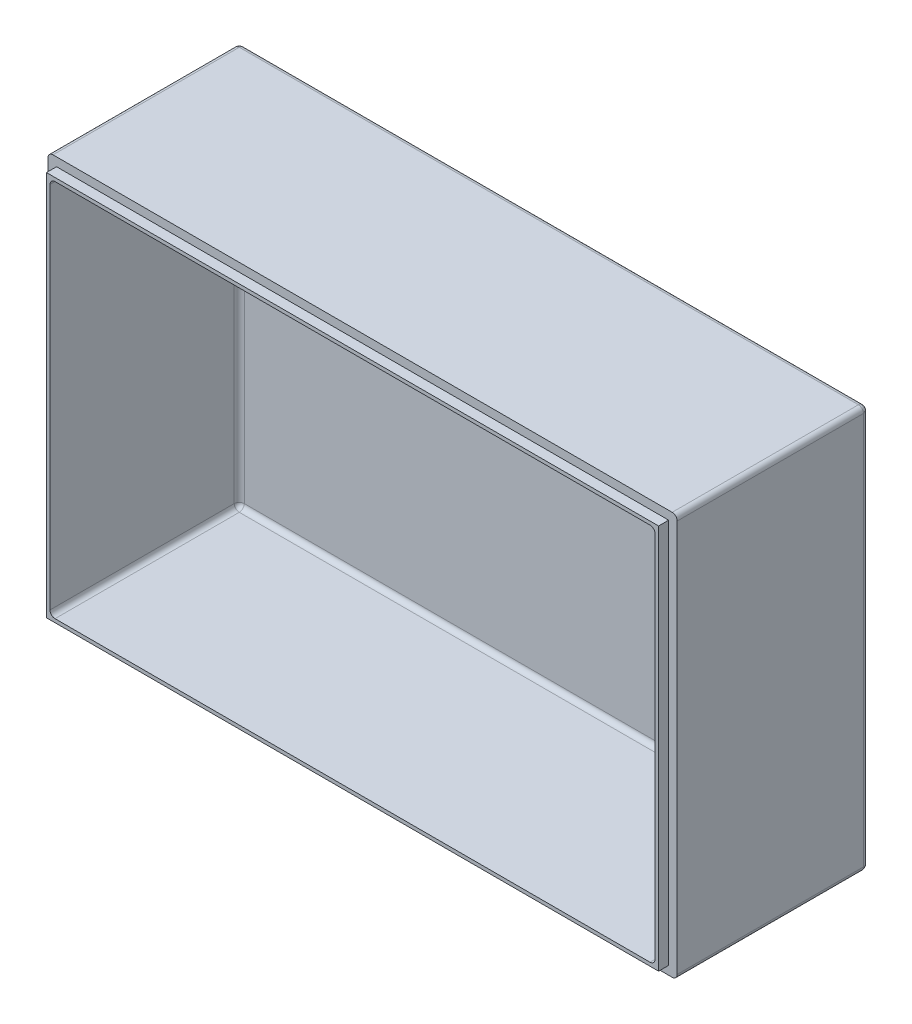
ISO-10303-21;
HEADER;
FILE_DESCRIPTION(('STEP AP214'),'2;1');
FILE_NAME('part.step','',(''),(''),'','','');
FILE_SCHEMA(('AUTOMOTIVE_DESIGN { 1 0 10303 214 1 1 1 1 }'));
ENDSEC;
DATA;
#1=APPLICATION_CONTEXT('core data for automotive mechanical design processes');
#2=APPLICATION_PROTOCOL_DEFINITION('international standard','automotive_design',2000,#1);
#3=PRODUCT_CONTEXT('',#1,'mechanical');
#4=PRODUCT('Part','Part','',(#3));
#5=PRODUCT_RELATED_PRODUCT_CATEGORY('part','',(#4));
#6=PRODUCT_DEFINITION_FORMATION('','',#4);
#7=PRODUCT_DEFINITION_CONTEXT('part definition',#1,'design');
#8=PRODUCT_DEFINITION('design','',#6,#7);
#9=PRODUCT_DEFINITION_SHAPE('','',#8);
#10=(LENGTH_UNIT() NAMED_UNIT(*) SI_UNIT(.MILLI.,.METRE.));
#11=(NAMED_UNIT(*) PLANE_ANGLE_UNIT() SI_UNIT($,.RADIAN.));
#12=(NAMED_UNIT(*) SI_UNIT($,.STERADIAN.) SOLID_ANGLE_UNIT());
#13=UNCERTAINTY_MEASURE_WITH_UNIT(LENGTH_MEASURE(1.E-05),#10,'distance_accuracy_value','');
#14=(GEOMETRIC_REPRESENTATION_CONTEXT(3) GLOBAL_UNCERTAINTY_ASSIGNED_CONTEXT((#13)) GLOBAL_UNIT_ASSIGNED_CONTEXT((#10,
#11,#12)) REPRESENTATION_CONTEXT('',''));
#15=CARTESIAN_POINT('',(0.,0.,0.));
#16=DIRECTION('',(0.,0.,1.));
#17=DIRECTION('',(1.,0.,0.));
#18=AXIS2_PLACEMENT_3D('',#15,#16,#17);
#19=CARTESIAN_POINT('',(0.,0.,40.));
#20=DIRECTION('',(0.,0.,1.));
#21=DIRECTION('',(1.,0.,0.));
#22=AXIS2_PLACEMENT_3D('',#19,#20,#21);
#23=PLANE('',#22);
#24=DIRECTION('',(0.,1.,0.));
#25=VECTOR('',#24,1.);
#26=CARTESIAN_POINT('',(60.1,37.6,40.));
#27=LINE('',#26,#25);
#28=CARTESIAN_POINT('',(60.1,-36.6,40.));
#29=VERTEX_POINT('',#28);
#30=CARTESIAN_POINT('',(60.1,36.6,40.));
#31=VERTEX_POINT('',#30);
#32=EDGE_CURVE('E253',#29,#31,#27,.T.);
#33=ORIENTED_EDGE('',*,*,#32,.F.);
#34=CARTESIAN_POINT('',(59.1,-36.6,40.));
#35=DIRECTION('',(0.,0.,1.));
#36=DIRECTION('',(1.,0.,0.));
#37=AXIS2_PLACEMENT_3D('',#34,#35,#36);
#38=CIRCLE('',#37,1.);
#39=CARTESIAN_POINT('',(59.1,-37.6,40.));
#40=VERTEX_POINT('',#39);
#41=EDGE_CURVE('E373',#29,#40,#38,.F.);
#42=ORIENTED_EDGE('',*,*,#41,.T.);
#43=DIRECTION('',(1.,0.,0.));
#44=VECTOR('',#43,1.);
#45=CARTESIAN_POINT('',(-60.1,-37.6,40.));
#46=LINE('',#45,#44);
#47=CARTESIAN_POINT('',(-59.1,-37.6,40.));
#48=VERTEX_POINT('',#47);
#49=EDGE_CURVE('E263',#48,#40,#46,.T.);
#50=ORIENTED_EDGE('',*,*,#49,.F.);
#51=CARTESIAN_POINT('',(-59.1,-36.6,40.));
#52=DIRECTION('',(0.,0.,1.));
#53=DIRECTION('',(1.,0.,0.));
#54=AXIS2_PLACEMENT_3D('',#51,#52,#53);
#55=CIRCLE('',#54,1.);
#56=CARTESIAN_POINT('',(-60.1,-36.6,40.));
#57=VERTEX_POINT('',#56);
#58=EDGE_CURVE('E11',#48,#57,#55,.F.);
#59=ORIENTED_EDGE('',*,*,#58,.T.);
#60=DIRECTION('',(0.,-1.,0.));
#61=VECTOR('',#60,1.);
#62=CARTESIAN_POINT('',(-60.1,37.6,40.));
#63=LINE('',#62,#61);
#64=CARTESIAN_POINT('',(-60.1,36.6,40.));
#65=VERTEX_POINT('',#64);
#66=EDGE_CURVE('E260',#65,#57,#63,.T.);
#67=ORIENTED_EDGE('',*,*,#66,.F.);
#68=CARTESIAN_POINT('',(-59.1,36.6,40.));
#69=DIRECTION('',(0.,0.,1.));
#70=DIRECTION('',(1.,0.,0.));
#71=AXIS2_PLACEMENT_3D('',#68,#69,#70);
#72=CIRCLE('',#71,1.);
#73=CARTESIAN_POINT('',(-59.1,37.6,40.));
#74=VERTEX_POINT('',#73);
#75=EDGE_CURVE('E46',#65,#74,#72,.F.);
#76=ORIENTED_EDGE('',*,*,#75,.T.);
#77=DIRECTION('',(-1.,0.,0.));
#78=VECTOR('',#77,1.);
#79=CARTESIAN_POINT('',(-60.1,37.6,40.));
#80=LINE('',#79,#78);
#81=CARTESIAN_POINT('',(59.1,37.6,40.));
#82=VERTEX_POINT('',#81);
#83=EDGE_CURVE('E256',#82,#74,#80,.T.);
#84=ORIENTED_EDGE('',*,*,#83,.F.);
#85=CARTESIAN_POINT('',(59.1,36.6,40.));
#86=DIRECTION('',(0.,0.,1.));
#87=DIRECTION('',(1.,0.,0.));
#88=AXIS2_PLACEMENT_3D('',#85,#86,#87);
#89=CIRCLE('',#88,1.);
#90=EDGE_CURVE('E371',#82,#31,#89,.F.);
#91=ORIENTED_EDGE('',*,*,#90,.T.);
#92=EDGE_LOOP('',(#33,#42,#50,#59,#67,#76,#84,#91));
#93=FACE_BOUND('',#92,.T.);
#94=DIRECTION('',(0.,-1.,0.));
#95=VECTOR('',#94,1.);
#96=CARTESIAN_POINT('',(-60.8,0.,40.));
#97=LINE('',#96,#95);
#98=CARTESIAN_POINT('',(-60.8,38.3,40.));
#99=VERTEX_POINT('',#98);
#100=CARTESIAN_POINT('',(-60.8,-38.3,40.));
#101=VERTEX_POINT('',#100);
#102=EDGE_CURVE('E243',#99,#101,#97,.T.);
#103=ORIENTED_EDGE('',*,*,#102,.T.);
#104=DIRECTION('',(1.,0.,0.));
#105=VECTOR('',#104,1.);
#106=CARTESIAN_POINT('',(0.,-38.3,40.));
#107=LINE('',#106,#105);
#108=CARTESIAN_POINT('',(60.8,-38.3,40.));
#109=VERTEX_POINT('',#108);
#110=EDGE_CURVE('E54',#101,#109,#107,.T.);
#111=ORIENTED_EDGE('',*,*,#110,.T.);
#112=DIRECTION('',(0.,1.,0.));
#113=VECTOR('',#112,1.);
#114=CARTESIAN_POINT('',(60.8,0.,40.));
#115=LINE('',#114,#113);
#116=CARTESIAN_POINT('',(60.8,38.3,40.));
#117=VERTEX_POINT('',#116);
#118=EDGE_CURVE('E219',#109,#117,#115,.T.);
#119=ORIENTED_EDGE('',*,*,#118,.T.);
#120=DIRECTION('',(-1.,0.,0.));
#121=VECTOR('',#120,1.);
#122=CARTESIAN_POINT('',(0.,38.3,40.));
#123=LINE('',#122,#121);
#124=EDGE_CURVE('E222',#117,#99,#123,.T.);
#125=ORIENTED_EDGE('',*,*,#124,.T.);
#126=EDGE_LOOP('',(#103,#111,#119,#125));
#127=FACE_BOUND('',#126,.T.);
#128=ADVANCED_FACE('F37',(#93,#127),#23,.T.);
#129=CARTESIAN_POINT('',(60.1,37.6,2.4));
#130=DIRECTION('',(1.,0.,0.));
#131=DIRECTION('',(0.,0.,-1.));
#132=AXIS2_PLACEMENT_3D('',#129,#130,#131);
#133=PLANE('',#132);
#134=ORIENTED_EDGE('',*,*,#32,.T.);
#135=DIRECTION('',(0.,0.,1.));
#136=VECTOR('',#135,1.);
#137=CARTESIAN_POINT('',(60.1,36.6,2.4));
#138=LINE('',#137,#136);
#139=CARTESIAN_POINT('',(60.1,36.6,3.4));
#140=VERTEX_POINT('',#139);
#141=EDGE_CURVE('E348',#31,#140,#138,.F.);
#142=ORIENTED_EDGE('',*,*,#141,.T.);
#143=DIRECTION('',(0.,1.,0.));
#144=VECTOR('',#143,1.);
#145=CARTESIAN_POINT('',(60.1,37.6,3.4));
#146=LINE('',#145,#144);
#147=CARTESIAN_POINT('',(60.1,-36.6,3.4));
#148=VERTEX_POINT('',#147);
#149=EDGE_CURVE('E346',#140,#148,#146,.F.);
#150=ORIENTED_EDGE('',*,*,#149,.T.);
#151=DIRECTION('',(0.,0.,1.));
#152=VECTOR('',#151,1.);
#153=CARTESIAN_POINT('',(60.1,-36.6,40.));
#154=LINE('',#153,#152);
#155=EDGE_CURVE('E344',#148,#29,#154,.T.);
#156=ORIENTED_EDGE('',*,*,#155,.T.);
#157=EDGE_LOOP('',(#134,#142,#150,#156));
#158=FACE_BOUND('',#157,.T.);
#159=ADVANCED_FACE('F469',(#158),#133,.F.);
#160=CARTESIAN_POINT('',(-60.1,-37.6,2.4));
#161=DIRECTION('',(0.,-1.,0.));
#162=DIRECTION('',(0.,0.,-1.));
#163=AXIS2_PLACEMENT_3D('',#160,#161,#162);
#164=PLANE('',#163);
#165=ORIENTED_EDGE('',*,*,#49,.T.);
#166=DIRECTION('',(0.,0.,1.));
#167=VECTOR('',#166,1.);
#168=CARTESIAN_POINT('',(59.1,-37.6,2.4));
#169=LINE('',#168,#167);
#170=CARTESIAN_POINT('',(59.1,-37.6,3.4));
#171=VERTEX_POINT('',#170);
#172=EDGE_CURVE('E363',#40,#171,#169,.F.);
#173=ORIENTED_EDGE('',*,*,#172,.T.);
#174=DIRECTION('',(1.,0.,0.));
#175=VECTOR('',#174,1.);
#176=CARTESIAN_POINT('',(-60.1,-37.6,3.4));
#177=LINE('',#176,#175);
#178=CARTESIAN_POINT('',(-59.1,-37.6,3.4));
#179=VERTEX_POINT('',#178);
#180=EDGE_CURVE('E361',#171,#179,#177,.F.);
#181=ORIENTED_EDGE('',*,*,#180,.T.);
#182=DIRECTION('',(0.,0.,1.));
#183=VECTOR('',#182,1.);
#184=CARTESIAN_POINT('',(-59.1,-37.6,40.));
#185=LINE('',#184,#183);
#186=EDGE_CURVE('E359',#179,#48,#185,.T.);
#187=ORIENTED_EDGE('',*,*,#186,.T.);
#188=EDGE_LOOP('',(#165,#173,#181,#187));
#189=FACE_BOUND('',#188,.T.);
#190=ADVANCED_FACE('F421',(#189),#164,.F.);
#191=CARTESIAN_POINT('',(-60.1,37.6,2.4));
#192=DIRECTION('',(-1.,0.,0.));
#193=DIRECTION('',(0.,0.,1.));
#194=AXIS2_PLACEMENT_3D('',#191,#192,#193);
#195=PLANE('',#194);
#196=DIRECTION('',(0.,-1.,0.));
#197=VECTOR('',#196,1.);
#198=CARTESIAN_POINT('',(-60.1,37.6,3.4));
#199=LINE('',#198,#197);
#200=CARTESIAN_POINT('',(-60.1,-36.6,3.4));
#201=VERTEX_POINT('',#200);
#202=CARTESIAN_POINT('',(-60.1,36.6,3.4));
#203=VERTEX_POINT('',#202);
#204=EDGE_CURVE('E365',#201,#203,#199,.F.);
#205=ORIENTED_EDGE('',*,*,#204,.T.);
#206=DIRECTION('',(0.,0.,1.));
#207=VECTOR('',#206,1.);
#208=CARTESIAN_POINT('',(-60.1,36.6,40.));
#209=LINE('',#208,#207);
#210=EDGE_CURVE('E369',#203,#65,#209,.T.);
#211=ORIENTED_EDGE('',*,*,#210,.T.);
#212=ORIENTED_EDGE('',*,*,#66,.T.);
#213=DIRECTION('',(0.,0.,1.));
#214=VECTOR('',#213,1.);
#215=CARTESIAN_POINT('',(-60.1,-36.6,2.4));
#216=LINE('',#215,#214);
#217=EDGE_CURVE('E367',#57,#201,#216,.F.);
#218=ORIENTED_EDGE('',*,*,#217,.T.);
#219=EDGE_LOOP('',(#205,#211,#212,#218));
#220=FACE_BOUND('',#219,.T.);
#221=ADVANCED_FACE('F451',(#220),#195,.F.);
#222=CARTESIAN_POINT('',(-60.1,37.6,2.4));
#223=DIRECTION('',(0.,1.,0.));
#224=DIRECTION('',(0.,0.,1.));
#225=AXIS2_PLACEMENT_3D('',#222,#223,#224);
#226=PLANE('',#225);
#227=DIRECTION('',(-1.,0.,0.));
#228=VECTOR('',#227,1.);
#229=CARTESIAN_POINT('',(-60.1,37.6,3.4));
#230=LINE('',#229,#228);
#231=CARTESIAN_POINT('',(-59.1,37.6,3.4));
#232=VERTEX_POINT('',#231);
#233=CARTESIAN_POINT('',(59.1,37.6,3.4));
#234=VERTEX_POINT('',#233);
#235=EDGE_CURVE('E339',#232,#234,#230,.F.);
#236=ORIENTED_EDGE('',*,*,#235,.T.);
#237=DIRECTION('',(0.,0.,1.));
#238=VECTOR('',#237,1.);
#239=CARTESIAN_POINT('',(59.1,37.6,40.));
#240=LINE('',#239,#238);
#241=EDGE_CURVE('E341',#234,#82,#240,.T.);
#242=ORIENTED_EDGE('',*,*,#241,.T.);
#243=ORIENTED_EDGE('',*,*,#83,.T.);
#244=DIRECTION('',(0.,0.,1.));
#245=VECTOR('',#244,1.);
#246=CARTESIAN_POINT('',(-59.1,37.6,2.4));
#247=LINE('',#246,#245);
#248=EDGE_CURVE('E304',#74,#232,#247,.F.);
#249=ORIENTED_EDGE('',*,*,#248,.T.);
#250=EDGE_LOOP('',(#236,#242,#243,#249));
#251=FACE_BOUND('',#250,.T.);
#252=ADVANCED_FACE('F460',(#251),#226,.F.);
#253=CARTESIAN_POINT('',(0.,0.,2.4));
#254=DIRECTION('',(0.,0.,1.));
#255=DIRECTION('',(1.,0.,0.));
#256=AXIS2_PLACEMENT_3D('',#253,#254,#255);
#257=PLANE('',#256);
#258=DIRECTION('',(1.,0.,0.));
#259=VECTOR('',#258,1.);
#260=CARTESIAN_POINT('',(0.,-36.6,2.4));
#261=LINE('',#260,#259);
#262=CARTESIAN_POINT('',(-59.1,-36.6,2.4));
#263=VERTEX_POINT('',#262);
#264=CARTESIAN_POINT('',(59.1,-36.6,2.4));
#265=VERTEX_POINT('',#264);
#266=EDGE_CURVE('E352',#263,#265,#261,.T.);
#267=ORIENTED_EDGE('',*,*,#266,.T.);
#268=DIRECTION('',(0.,1.,0.));
#269=VECTOR('',#268,1.);
#270=CARTESIAN_POINT('',(59.1,0.,2.4));
#271=LINE('',#270,#269);
#272=CARTESIAN_POINT('',(59.1,36.6,2.4));
#273=VERTEX_POINT('',#272);
#274=EDGE_CURVE('E356',#265,#273,#271,.T.);
#275=ORIENTED_EDGE('',*,*,#274,.T.);
#276=DIRECTION('',(-1.,0.,0.));
#277=VECTOR('',#276,1.);
#278=CARTESIAN_POINT('',(0.,36.6,2.4));
#279=LINE('',#278,#277);
#280=CARTESIAN_POINT('',(-59.1,36.6,2.4));
#281=VERTEX_POINT('',#280);
#282=EDGE_CURVE('E354',#273,#281,#279,.T.);
#283=ORIENTED_EDGE('',*,*,#282,.T.);
#284=DIRECTION('',(0.,-1.,0.));
#285=VECTOR('',#284,1.);
#286=CARTESIAN_POINT('',(-59.1,0.,2.4));
#287=LINE('',#286,#285);
#288=EDGE_CURVE('E350',#281,#263,#287,.T.);
#289=ORIENTED_EDGE('',*,*,#288,.T.);
#290=EDGE_LOOP('',(#267,#275,#283,#289));
#291=FACE_BOUND('',#290,.T.);
#292=ADVANCED_FACE('F444',(#291),#257,.T.);
#293=CARTESIAN_POINT('',(-59.1,-36.6,2.4));
#294=DIRECTION('',(0.,0.,-1.));
#295=DIRECTION('',(-1.,0.,0.));
#296=AXIS2_PLACEMENT_3D('',#293,#294,#295);
#297=CYLINDRICAL_SURFACE('',#296,1.);
#298=CARTESIAN_POINT('',(-59.1,-36.6,3.4));
#299=DIRECTION('',(0.,0.,1.));
#300=DIRECTION('',(1.,0.,0.));
#301=AXIS2_PLACEMENT_3D('',#298,#299,#300);
#302=CIRCLE('',#301,1.);
#303=EDGE_CURVE('E41',#201,#179,#302,.T.);
#304=ORIENTED_EDGE('',*,*,#303,.F.);
#305=ORIENTED_EDGE('',*,*,#217,.F.);
#306=ORIENTED_EDGE('',*,*,#58,.F.);
#307=ORIENTED_EDGE('',*,*,#186,.F.);
#308=EDGE_LOOP('',(#304,#305,#306,#307));
#309=FACE_BOUND('',#308,.T.);
#310=ADVANCED_FACE('F39',(#309),#297,.F.);
#311=CARTESIAN_POINT('',(-59.1,-36.6,3.4));
#312=DIRECTION('',(0.,0.,1.));
#313=DIRECTION('',(1.,0.,0.));
#314=AXIS2_PLACEMENT_3D('',#311,#312,#313);
#315=SPHERICAL_SURFACE('',#314,1.);
#316=CARTESIAN_POINT('',(-59.1,-36.6,3.4));
#317=DIRECTION('',(0.,1.,0.));
#318=DIRECTION('',(0.,0.,1.));
#319=AXIS2_PLACEMENT_3D('',#316,#317,#318);
#320=CIRCLE('',#319,1.);
#321=EDGE_CURVE('E401',#201,#263,#320,.F.);
#322=ORIENTED_EDGE('',*,*,#321,.F.);
#323=ORIENTED_EDGE('',*,*,#303,.T.);
#324=CARTESIAN_POINT('',(-59.1,-36.6,3.4));
#325=DIRECTION('',(1.,0.,0.));
#326=DIRECTION('',(0.,0.,-1.));
#327=AXIS2_PLACEMENT_3D('',#324,#325,#326);
#328=CIRCLE('',#327,1.);
#329=EDGE_CURVE('E403',#263,#179,#328,.F.);
#330=ORIENTED_EDGE('',*,*,#329,.F.);
#331=EDGE_LOOP('',(#322,#323,#330));
#332=FACE_BOUND('',#331,.T.);
#333=ADVANCED_FACE('F413',(#332),#315,.F.);
#334=CARTESIAN_POINT('',(59.1,-36.6,2.4));
#335=DIRECTION('',(0.,0.,-1.));
#336=DIRECTION('',(-1.,0.,0.));
#337=AXIS2_PLACEMENT_3D('',#334,#335,#336);
#338=CYLINDRICAL_SURFACE('',#337,1.);
#339=ORIENTED_EDGE('',*,*,#41,.F.);
#340=ORIENTED_EDGE('',*,*,#155,.F.);
#341=CARTESIAN_POINT('',(59.1,-36.6,3.4));
#342=DIRECTION('',(0.,0.,1.));
#343=DIRECTION('',(1.,0.,0.));
#344=AXIS2_PLACEMENT_3D('',#341,#342,#343);
#345=CIRCLE('',#344,1.);
#346=EDGE_CURVE('E398',#171,#148,#345,.T.);
#347=ORIENTED_EDGE('',*,*,#346,.F.);
#348=ORIENTED_EDGE('',*,*,#172,.F.);
#349=EDGE_LOOP('',(#339,#340,#347,#348));
#350=FACE_BOUND('',#349,.T.);
#351=ADVANCED_FACE('F430',(#350),#338,.F.);
#352=CARTESIAN_POINT('',(0.,-36.6,3.4));
#353=DIRECTION('',(1.,0.,0.));
#354=DIRECTION('',(0.,0.,-1.));
#355=AXIS2_PLACEMENT_3D('',#352,#353,#354);
#356=CYLINDRICAL_SURFACE('',#355,1.);
#357=ORIENTED_EDGE('',*,*,#329,.T.);
#358=ORIENTED_EDGE('',*,*,#180,.F.);
#359=CARTESIAN_POINT('',(59.1,-36.6,3.4));
#360=DIRECTION('',(-1.,0.,0.));
#361=DIRECTION('',(0.,0.,1.));
#362=AXIS2_PLACEMENT_3D('',#359,#360,#361);
#363=CIRCLE('',#362,1.);
#364=EDGE_CURVE('E395',#265,#171,#363,.T.);
#365=ORIENTED_EDGE('',*,*,#364,.F.);
#366=ORIENTED_EDGE('',*,*,#266,.F.);
#367=EDGE_LOOP('',(#357,#358,#365,#366));
#368=FACE_BOUND('',#367,.T.);
#369=ADVANCED_FACE('F433',(#368),#356,.F.);
#370=CARTESIAN_POINT('',(-59.1,0.,3.4));
#371=DIRECTION('',(0.,-1.,0.));
#372=DIRECTION('',(0.,0.,-1.));
#373=AXIS2_PLACEMENT_3D('',#370,#371,#372);
#374=CYLINDRICAL_SURFACE('',#373,1.);
#375=ORIENTED_EDGE('',*,*,#321,.T.);
#376=ORIENTED_EDGE('',*,*,#288,.F.);
#377=CARTESIAN_POINT('',(-59.1,36.6,3.4));
#378=DIRECTION('',(0.,-1.,0.));
#379=DIRECTION('',(0.,0.,-1.));
#380=AXIS2_PLACEMENT_3D('',#377,#378,#379);
#381=CIRCLE('',#380,1.);
#382=EDGE_CURVE('E392',#203,#281,#381,.T.);
#383=ORIENTED_EDGE('',*,*,#382,.F.);
#384=ORIENTED_EDGE('',*,*,#204,.F.);
#385=EDGE_LOOP('',(#375,#376,#383,#384));
#386=FACE_BOUND('',#385,.T.);
#387=ADVANCED_FACE('F448',(#386),#374,.F.);
#388=CARTESIAN_POINT('',(-59.1,36.6,2.4));
#389=DIRECTION('',(0.,0.,-1.));
#390=DIRECTION('',(-1.,0.,0.));
#391=AXIS2_PLACEMENT_3D('',#388,#389,#390);
#392=CYLINDRICAL_SURFACE('',#391,1.);
#393=ORIENTED_EDGE('',*,*,#75,.F.);
#394=ORIENTED_EDGE('',*,*,#210,.F.);
#395=CARTESIAN_POINT('',(-59.1,36.6,3.4));
#396=DIRECTION('',(0.,0.,1.));
#397=DIRECTION('',(1.,0.,0.));
#398=AXIS2_PLACEMENT_3D('',#395,#396,#397);
#399=CIRCLE('',#398,1.);
#400=EDGE_CURVE('E389',#232,#203,#399,.T.);
#401=ORIENTED_EDGE('',*,*,#400,.F.);
#402=ORIENTED_EDGE('',*,*,#248,.F.);
#403=EDGE_LOOP('',(#393,#394,#401,#402));
#404=FACE_BOUND('',#403,.T.);
#405=ADVANCED_FACE('F455',(#404),#392,.F.);
#406=CARTESIAN_POINT('',(59.1,-36.6,3.4));
#407=DIRECTION('',(0.,0.,1.));
#408=DIRECTION('',(1.,0.,0.));
#409=AXIS2_PLACEMENT_3D('',#406,#407,#408);
#410=SPHERICAL_SURFACE('',#409,1.);
#411=ORIENTED_EDGE('',*,*,#364,.T.);
#412=ORIENTED_EDGE('',*,*,#346,.T.);
#413=CARTESIAN_POINT('',(59.1,-36.6,3.4));
#414=DIRECTION('',(0.,1.,0.));
#415=DIRECTION('',(0.,0.,1.));
#416=AXIS2_PLACEMENT_3D('',#413,#414,#415);
#417=CIRCLE('',#416,1.);
#418=EDGE_CURVE('E386',#265,#148,#417,.F.);
#419=ORIENTED_EDGE('',*,*,#418,.F.);
#420=EDGE_LOOP('',(#411,#412,#419));
#421=FACE_BOUND('',#420,.T.);
#422=ADVANCED_FACE('F437',(#421),#410,.F.);
#423=CARTESIAN_POINT('',(-59.1,36.6,3.4));
#424=DIRECTION('',(0.,0.,1.));
#425=DIRECTION('',(1.,0.,0.));
#426=AXIS2_PLACEMENT_3D('',#423,#424,#425);
#427=SPHERICAL_SURFACE('',#426,1.);
#428=ORIENTED_EDGE('',*,*,#400,.T.);
#429=ORIENTED_EDGE('',*,*,#382,.T.);
#430=CARTESIAN_POINT('',(-59.1,36.6,3.4));
#431=DIRECTION('',(1.,0.,0.));
#432=DIRECTION('',(0.,0.,-1.));
#433=AXIS2_PLACEMENT_3D('',#430,#431,#432);
#434=CIRCLE('',#433,1.);
#435=EDGE_CURVE('E383',#232,#281,#434,.F.);
#436=ORIENTED_EDGE('',*,*,#435,.F.);
#437=EDGE_LOOP('',(#428,#429,#436));
#438=FACE_BOUND('',#437,.T.);
#439=ADVANCED_FACE('F475',(#438),#427,.F.);
#440=CARTESIAN_POINT('',(59.1,0.,3.4));
#441=DIRECTION('',(0.,1.,0.));
#442=DIRECTION('',(0.,0.,1.));
#443=AXIS2_PLACEMENT_3D('',#440,#441,#442);
#444=CYLINDRICAL_SURFACE('',#443,1.);
#445=ORIENTED_EDGE('',*,*,#418,.T.);
#446=ORIENTED_EDGE('',*,*,#149,.F.);
#447=CARTESIAN_POINT('',(59.1,36.6,3.4));
#448=DIRECTION('',(0.,-1.,0.));
#449=DIRECTION('',(0.,0.,-1.));
#450=AXIS2_PLACEMENT_3D('',#447,#448,#449);
#451=CIRCLE('',#450,1.);
#452=EDGE_CURVE('E380',#273,#140,#451,.T.);
#453=ORIENTED_EDGE('',*,*,#452,.F.);
#454=ORIENTED_EDGE('',*,*,#274,.F.);
#455=EDGE_LOOP('',(#445,#446,#453,#454));
#456=FACE_BOUND('',#455,.T.);
#457=ADVANCED_FACE('F441',(#456),#444,.F.);
#458=CARTESIAN_POINT('',(0.,36.6,3.4));
#459=DIRECTION('',(-1.,0.,0.));
#460=DIRECTION('',(0.,0.,1.));
#461=AXIS2_PLACEMENT_3D('',#458,#459,#460);
#462=CYLINDRICAL_SURFACE('',#461,1.);
#463=ORIENTED_EDGE('',*,*,#435,.T.);
#464=ORIENTED_EDGE('',*,*,#282,.F.);
#465=CARTESIAN_POINT('',(59.1,36.6,3.4));
#466=DIRECTION('',(-1.,0.,0.));
#467=DIRECTION('',(0.,0.,1.));
#468=AXIS2_PLACEMENT_3D('',#465,#466,#467);
#469=CIRCLE('',#468,1.);
#470=EDGE_CURVE('E378',#234,#273,#469,.T.);
#471=ORIENTED_EDGE('',*,*,#470,.F.);
#472=ORIENTED_EDGE('',*,*,#235,.F.);
#473=EDGE_LOOP('',(#463,#464,#471,#472));
#474=FACE_BOUND('',#473,.T.);
#475=ADVANCED_FACE('F473',(#474),#462,.F.);
#476=CARTESIAN_POINT('',(59.1,36.6,3.4));
#477=DIRECTION('',(0.,0.,1.));
#478=DIRECTION('',(1.,0.,0.));
#479=AXIS2_PLACEMENT_3D('',#476,#477,#478);
#480=SPHERICAL_SURFACE('',#479,1.);
#481=ORIENTED_EDGE('',*,*,#470,.T.);
#482=ORIENTED_EDGE('',*,*,#452,.T.);
#483=CARTESIAN_POINT('',(59.1,36.6,3.4));
#484=DIRECTION('',(0.,0.,1.));
#485=DIRECTION('',(1.,0.,0.));
#486=AXIS2_PLACEMENT_3D('',#483,#484,#485);
#487=CIRCLE('',#486,1.);
#488=EDGE_CURVE('E249',#234,#140,#487,.F.);
#489=ORIENTED_EDGE('',*,*,#488,.F.);
#490=EDGE_LOOP('',(#481,#482,#489));
#491=FACE_BOUND('',#490,.T.);
#492=ADVANCED_FACE('F471',(#491),#480,.F.);
#493=CARTESIAN_POINT('',(59.1,36.6,2.4));
#494=DIRECTION('',(0.,0.,-1.));
#495=DIRECTION('',(-1.,0.,0.));
#496=AXIS2_PLACEMENT_3D('',#493,#494,#495);
#497=CYLINDRICAL_SURFACE('',#496,1.);
#498=ORIENTED_EDGE('',*,*,#488,.T.);
#499=ORIENTED_EDGE('',*,*,#141,.F.);
#500=ORIENTED_EDGE('',*,*,#90,.F.);
#501=ORIENTED_EDGE('',*,*,#241,.F.);
#502=EDGE_LOOP('',(#498,#499,#500,#501));
#503=FACE_BOUND('',#502,.T.);
#504=ADVANCED_FACE('F465',(#503),#497,.F.);
#505=CARTESIAN_POINT('',(0.,-38.3,38.));
#506=DIRECTION('',(0.,-1.,0.));
#507=DIRECTION('',(1.,0.,0.));
#508=AXIS2_PLACEMENT_3D('',#505,#506,#507);
#509=PLANE('',#508);
#510=ORIENTED_EDGE('',*,*,#110,.F.);
#511=DIRECTION('',(0.,0.,1.));
#512=VECTOR('',#511,1.);
#513=CARTESIAN_POINT('',(-60.8,-38.3,38.));
#514=LINE('',#513,#512);
#515=CARTESIAN_POINT('',(-60.8,-38.3,38.));
#516=VERTEX_POINT('',#515);
#517=EDGE_CURVE('E204',#516,#101,#514,.T.);
#518=ORIENTED_EDGE('',*,*,#517,.F.);
#519=DIRECTION('',(1.,0.,0.));
#520=VECTOR('',#519,1.);
#521=CARTESIAN_POINT('',(0.,-38.3,38.));
#522=LINE('',#521,#520);
#523=CARTESIAN_POINT('',(60.8,-38.3,38.));
#524=VERTEX_POINT('',#523);
#525=EDGE_CURVE('E211',#516,#524,#522,.T.);
#526=ORIENTED_EDGE('',*,*,#525,.T.);
#527=DIRECTION('',(0.,0.,1.));
#528=VECTOR('',#527,1.);
#529=CARTESIAN_POINT('',(60.8,-38.3,38.));
#530=LINE('',#529,#528);
#531=EDGE_CURVE('E247',#524,#109,#530,.T.);
#532=ORIENTED_EDGE('',*,*,#531,.T.);
#533=EDGE_LOOP('',(#510,#518,#526,#532));
#534=FACE_BOUND('',#533,.T.);
#535=ADVANCED_FACE('F214',(#534),#509,.T.);
#536=CARTESIAN_POINT('',(60.8,0.,38.));
#537=DIRECTION('',(1.,0.,0.));
#538=DIRECTION('',(0.,0.,-1.));
#539=AXIS2_PLACEMENT_3D('',#536,#537,#538);
#540=PLANE('',#539);
#541=ORIENTED_EDGE('',*,*,#118,.F.);
#542=ORIENTED_EDGE('',*,*,#531,.F.);
#543=DIRECTION('',(0.,1.,0.));
#544=VECTOR('',#543,1.);
#545=CARTESIAN_POINT('',(60.8,0.,38.));
#546=LINE('',#545,#544);
#547=CARTESIAN_POINT('',(60.8,38.3,38.));
#548=VERTEX_POINT('',#547);
#549=EDGE_CURVE('E218',#524,#548,#546,.T.);
#550=ORIENTED_EDGE('',*,*,#549,.T.);
#551=DIRECTION('',(0.,0.,1.));
#552=VECTOR('',#551,1.);
#553=CARTESIAN_POINT('',(60.8,38.3,38.));
#554=LINE('',#553,#552);
#555=EDGE_CURVE('E250',#548,#117,#554,.T.);
#556=ORIENTED_EDGE('',*,*,#555,.T.);
#557=EDGE_LOOP('',(#541,#542,#550,#556));
#558=FACE_BOUND('',#557,.T.);
#559=ADVANCED_FACE('F583',(#558),#540,.T.);
#560=CARTESIAN_POINT('',(0.,38.3,38.));
#561=DIRECTION('',(0.,1.,0.));
#562=DIRECTION('',(-1.,0.,0.));
#563=AXIS2_PLACEMENT_3D('',#560,#561,#562);
#564=PLANE('',#563);
#565=ORIENTED_EDGE('',*,*,#124,.F.);
#566=ORIENTED_EDGE('',*,*,#555,.F.);
#567=DIRECTION('',(-1.,0.,0.));
#568=VECTOR('',#567,1.);
#569=CARTESIAN_POINT('',(0.,38.3,38.));
#570=LINE('',#569,#568);
#571=CARTESIAN_POINT('',(-60.8,38.3,38.));
#572=VERTEX_POINT('',#571);
#573=EDGE_CURVE('E210',#548,#572,#570,.T.);
#574=ORIENTED_EDGE('',*,*,#573,.T.);
#575=DIRECTION('',(0.,0.,1.));
#576=VECTOR('',#575,1.);
#577=CARTESIAN_POINT('',(-60.8,38.3,38.));
#578=LINE('',#577,#576);
#579=EDGE_CURVE('E206',#572,#99,#578,.T.);
#580=ORIENTED_EDGE('',*,*,#579,.T.);
#581=EDGE_LOOP('',(#565,#566,#574,#580));
#582=FACE_BOUND('',#581,.T.);
#583=ADVANCED_FACE('F590',(#582),#564,.T.);
#584=CARTESIAN_POINT('',(-60.8,0.,38.));
#585=DIRECTION('',(-1.,0.,0.));
#586=DIRECTION('',(0.,-1.,0.));
#587=AXIS2_PLACEMENT_3D('',#584,#585,#586);
#588=PLANE('',#587);
#589=ORIENTED_EDGE('',*,*,#102,.F.);
#590=ORIENTED_EDGE('',*,*,#579,.F.);
#591=DIRECTION('',(0.,-1.,0.));
#592=VECTOR('',#591,1.);
#593=CARTESIAN_POINT('',(-60.8,0.,38.));
#594=LINE('',#593,#592);
#595=EDGE_CURVE('E201',#572,#516,#594,.T.);
#596=ORIENTED_EDGE('',*,*,#595,.T.);
#597=ORIENTED_EDGE('',*,*,#517,.T.);
#598=EDGE_LOOP('',(#589,#590,#596,#597));
#599=FACE_BOUND('',#598,.T.);
#600=ADVANCED_FACE('F203',(#599),#588,.T.);
#601=CARTESIAN_POINT('',(0.,0.,38.));
#602=DIRECTION('',(0.,0.,1.));
#603=DIRECTION('',(1.,0.,0.));
#604=AXIS2_PLACEMENT_3D('',#601,#602,#603);
#605=PLANE('',#604);
#606=ORIENTED_EDGE('',*,*,#525,.F.);
#607=ORIENTED_EDGE('',*,*,#595,.F.);
#608=ORIENTED_EDGE('',*,*,#573,.F.);
#609=ORIENTED_EDGE('',*,*,#549,.F.);
#610=EDGE_LOOP('',(#606,#607,#608,#609));
#611=FACE_BOUND('',#610,.T.);
#612=CARTESIAN_POINT('',(-61.5,-39.,38.));
#613=DIRECTION('',(0.,0.,1.));
#614=DIRECTION('',(1.,0.,0.));
#615=AXIS2_PLACEMENT_3D('',#612,#613,#614);
#616=CIRCLE('',#615,1.);
#617=CARTESIAN_POINT('',(-62.5,-39.,38.));
#618=VERTEX_POINT('',#617);
#619=CARTESIAN_POINT('',(-61.5,-40.,38.));
#620=VERTEX_POINT('',#619);
#621=EDGE_CURVE('E227',#618,#620,#616,.T.);
#622=ORIENTED_EDGE('',*,*,#621,.T.);
#623=DIRECTION('',(1.,0.,0.));
#624=VECTOR('',#623,1.);
#625=CARTESIAN_POINT('',(0.,-40.,38.));
#626=LINE('',#625,#624);
#627=CARTESIAN_POINT('',(61.5,-40.,38.));
#628=VERTEX_POINT('',#627);
#629=EDGE_CURVE('E229',#620,#628,#626,.T.);
#630=ORIENTED_EDGE('',*,*,#629,.T.);
#631=CARTESIAN_POINT('',(61.5,-39.,38.));
#632=DIRECTION('',(0.,0.,1.));
#633=DIRECTION('',(1.,0.,0.));
#634=AXIS2_PLACEMENT_3D('',#631,#632,#633);
#635=CIRCLE('',#634,1.);
#636=CARTESIAN_POINT('',(62.5,-39.,38.));
#637=VERTEX_POINT('',#636);
#638=EDGE_CURVE('E231',#628,#637,#635,.T.);
#639=ORIENTED_EDGE('',*,*,#638,.T.);
#640=DIRECTION('',(0.,1.,0.));
#641=VECTOR('',#640,1.);
#642=CARTESIAN_POINT('',(62.5,0.,38.));
#643=LINE('',#642,#641);
#644=CARTESIAN_POINT('',(62.5,39.,38.));
#645=VERTEX_POINT('',#644);
#646=EDGE_CURVE('E233',#637,#645,#643,.T.);
#647=ORIENTED_EDGE('',*,*,#646,.T.);
#648=CARTESIAN_POINT('',(61.5,39.,38.));
#649=DIRECTION('',(0.,0.,1.));
#650=DIRECTION('',(1.,0.,0.));
#651=AXIS2_PLACEMENT_3D('',#648,#649,#650);
#652=CIRCLE('',#651,1.);
#653=CARTESIAN_POINT('',(61.5,40.,38.));
#654=VERTEX_POINT('',#653);
#655=EDGE_CURVE('E235',#645,#654,#652,.T.);
#656=ORIENTED_EDGE('',*,*,#655,.T.);
#657=DIRECTION('',(-1.,0.,0.));
#658=VECTOR('',#657,1.);
#659=CARTESIAN_POINT('',(0.,40.,38.));
#660=LINE('',#659,#658);
#661=CARTESIAN_POINT('',(-61.5,40.,38.));
#662=VERTEX_POINT('',#661);
#663=EDGE_CURVE('E237',#654,#662,#660,.T.);
#664=ORIENTED_EDGE('',*,*,#663,.T.);
#665=CARTESIAN_POINT('',(-61.5,39.,38.));
#666=DIRECTION('',(0.,0.,1.));
#667=DIRECTION('',(1.,0.,0.));
#668=AXIS2_PLACEMENT_3D('',#665,#666,#667);
#669=CIRCLE('',#668,1.);
#670=CARTESIAN_POINT('',(-62.5,39.,38.));
#671=VERTEX_POINT('',#670);
#672=EDGE_CURVE('E239',#662,#671,#669,.T.);
#673=ORIENTED_EDGE('',*,*,#672,.T.);
#674=DIRECTION('',(0.,-1.,0.));
#675=VECTOR('',#674,1.);
#676=CARTESIAN_POINT('',(-62.5,0.,38.));
#677=LINE('',#676,#675);
#678=EDGE_CURVE('E62',#671,#618,#677,.T.);
#679=ORIENTED_EDGE('',*,*,#678,.T.);
#680=EDGE_LOOP('',(#622,#630,#639,#647,#656,#664,#673,#679));
#681=FACE_BOUND('',#680,.T.);
#682=ADVANCED_FACE('F217',(#611,#681),#605,.T.);
#683=CARTESIAN_POINT('',(0.,0.,0.));
#684=DIRECTION('',(0.,0.,1.));
#685=DIRECTION('',(1.,0.,0.));
#686=AXIS2_PLACEMENT_3D('',#683,#684,#685);
#687=PLANE('',#686);
#688=DIRECTION('',(0.,-1.,0.));
#689=VECTOR('',#688,1.);
#690=CARTESIAN_POINT('',(-61.5,0.,0.));
#691=LINE('',#690,#689);
#692=CARTESIAN_POINT('',(-61.5,-39.,0.));
#693=VERTEX_POINT('',#692);
#694=CARTESIAN_POINT('',(-61.5,39.,0.));
#695=VERTEX_POINT('',#694);
#696=EDGE_CURVE('E278',#693,#695,#691,.F.);
#697=ORIENTED_EDGE('',*,*,#696,.T.);
#698=DIRECTION('',(-1.,0.,0.));
#699=VECTOR('',#698,1.);
#700=CARTESIAN_POINT('',(0.,39.,0.));
#701=LINE('',#700,#699);
#702=CARTESIAN_POINT('',(61.5,39.,0.));
#703=VERTEX_POINT('',#702);
#704=EDGE_CURVE('E281',#695,#703,#701,.F.);
#705=ORIENTED_EDGE('',*,*,#704,.T.);
#706=DIRECTION('',(0.,1.,0.));
#707=VECTOR('',#706,1.);
#708=CARTESIAN_POINT('',(61.5,0.,0.));
#709=LINE('',#708,#707);
#710=CARTESIAN_POINT('',(61.5,-39.,0.));
#711=VERTEX_POINT('',#710);
#712=EDGE_CURVE('E276',#703,#711,#709,.F.);
#713=ORIENTED_EDGE('',*,*,#712,.T.);
#714=DIRECTION('',(1.,0.,0.));
#715=VECTOR('',#714,1.);
#716=CARTESIAN_POINT('',(0.,-39.,0.));
#717=LINE('',#716,#715);
#718=EDGE_CURVE('E274',#711,#693,#717,.F.);
#719=ORIENTED_EDGE('',*,*,#718,.T.);
#720=EDGE_LOOP('',(#697,#705,#713,#719));
#721=FACE_BOUND('',#720,.T.);
#722=ADVANCED_FACE('F492',(#721),#687,.F.);
#723=CARTESIAN_POINT('',(61.5,40.,1.));
#724=DIRECTION('',(0.,1.,0.));
#725=DIRECTION('',(0.,0.,1.));
#726=AXIS2_PLACEMENT_3D('',#723,#724,#725);
#727=CYLINDRICAL_SURFACE('',#726,1.);
#728=CARTESIAN_POINT('',(61.5,39.,1.));
#729=DIRECTION('',(0.,1.,0.));
#730=DIRECTION('',(0.,0.,1.));
#731=AXIS2_PLACEMENT_3D('',#728,#729,#730);
#732=CIRCLE('',#731,1.);
#733=CARTESIAN_POINT('',(62.5,39.,1.));
#734=VERTEX_POINT('',#733);
#735=EDGE_CURVE('E257',#734,#703,#732,.T.);
#736=ORIENTED_EDGE('',*,*,#735,.F.);
#737=DIRECTION('',(0.,1.,0.));
#738=VECTOR('',#737,1.);
#739=CARTESIAN_POINT('',(62.5,40.,1.));
#740=LINE('',#739,#738);
#741=CARTESIAN_POINT('',(62.5,-39.,1.));
#742=VERTEX_POINT('',#741);
#743=EDGE_CURVE('E283',#742,#734,#740,.T.);
#744=ORIENTED_EDGE('',*,*,#743,.F.);
#745=CARTESIAN_POINT('',(61.5,-39.,1.));
#746=DIRECTION('',(0.,-1.,0.));
#747=DIRECTION('',(0.,0.,-1.));
#748=AXIS2_PLACEMENT_3D('',#745,#746,#747);
#749=CIRCLE('',#748,1.);
#750=EDGE_CURVE('E327',#711,#742,#749,.T.);
#751=ORIENTED_EDGE('',*,*,#750,.F.);
#752=ORIENTED_EDGE('',*,*,#712,.F.);
#753=EDGE_LOOP('',(#736,#744,#751,#752));
#754=FACE_BOUND('',#753,.T.);
#755=ADVANCED_FACE('F495',(#754),#727,.T.);
#756=CARTESIAN_POINT('',(-62.5,39.,1.));
#757=DIRECTION('',(-1.,0.,0.));
#758=DIRECTION('',(0.,0.,1.));
#759=AXIS2_PLACEMENT_3D('',#756,#757,#758);
#760=CYLINDRICAL_SURFACE('',#759,1.);
#761=CARTESIAN_POINT('',(61.5,39.,1.));
#762=DIRECTION('',(1.,0.,0.));
#763=DIRECTION('',(0.,1.,0.));
#764=AXIS2_PLACEMENT_3D('',#761,#762,#763);
#765=CIRCLE('',#764,1.);
#766=CARTESIAN_POINT('',(61.5,40.,1.));
#767=VERTEX_POINT('',#766);
#768=EDGE_CURVE('E324',#767,#703,#765,.F.);
#769=ORIENTED_EDGE('',*,*,#768,.T.);
#770=ORIENTED_EDGE('',*,*,#704,.F.);
#771=CARTESIAN_POINT('',(-61.5,39.,1.));
#772=DIRECTION('',(-1.,0.,0.));
#773=DIRECTION('',(0.,0.,1.));
#774=AXIS2_PLACEMENT_3D('',#771,#772,#773);
#775=CIRCLE('',#774,1.);
#776=CARTESIAN_POINT('',(-61.5,40.,1.));
#777=VERTEX_POINT('',#776);
#778=EDGE_CURVE('E318',#777,#695,#775,.T.);
#779=ORIENTED_EDGE('',*,*,#778,.F.);
#780=DIRECTION('',(-1.,0.,0.));
#781=VECTOR('',#780,1.);
#782=CARTESIAN_POINT('',(-62.5,40.,1.));
#783=LINE('',#782,#781);
#784=EDGE_CURVE('E300',#767,#777,#783,.T.);
#785=ORIENTED_EDGE('',*,*,#784,.F.);
#786=EDGE_LOOP('',(#769,#770,#779,#785));
#787=FACE_BOUND('',#786,.T.);
#788=ADVANCED_FACE('F520',(#787),#760,.T.);
#789=CARTESIAN_POINT('',(-61.5,40.,1.));
#790=DIRECTION('',(0.,-1.,0.));
#791=DIRECTION('',(0.,0.,-1.));
#792=AXIS2_PLACEMENT_3D('',#789,#790,#791);
#793=CYLINDRICAL_SURFACE('',#792,1.);
#794=CARTESIAN_POINT('',(-61.5,39.,1.));
#795=DIRECTION('',(0.,1.,0.));
#796=DIRECTION('',(0.,0.,1.));
#797=AXIS2_PLACEMENT_3D('',#794,#795,#796);
#798=CIRCLE('',#797,1.);
#799=CARTESIAN_POINT('',(-62.5,39.,1.));
#800=VERTEX_POINT('',#799);
#801=EDGE_CURVE('E307',#800,#695,#798,.F.);
#802=ORIENTED_EDGE('',*,*,#801,.T.);
#803=ORIENTED_EDGE('',*,*,#696,.F.);
#804=CARTESIAN_POINT('',(-61.5,-39.,1.));
#805=DIRECTION('',(0.,-1.,0.));
#806=DIRECTION('',(0.,0.,-1.));
#807=AXIS2_PLACEMENT_3D('',#804,#805,#806);
#808=CIRCLE('',#807,1.);
#809=CARTESIAN_POINT('',(-62.5,-39.,1.));
#810=VERTEX_POINT('',#809);
#811=EDGE_CURVE('E305',#693,#810,#808,.F.);
#812=ORIENTED_EDGE('',*,*,#811,.T.);
#813=DIRECTION('',(0.,-1.,0.));
#814=VECTOR('',#813,1.);
#815=CARTESIAN_POINT('',(-62.5,40.,1.));
#816=LINE('',#815,#814);
#817=EDGE_CURVE('E269',#800,#810,#816,.T.);
#818=ORIENTED_EDGE('',*,*,#817,.F.);
#819=EDGE_LOOP('',(#802,#803,#812,#818));
#820=FACE_BOUND('',#819,.T.);
#821=ADVANCED_FACE('F516',(#820),#793,.T.);
#822=CARTESIAN_POINT('',(-62.5,-39.,1.));
#823=DIRECTION('',(1.,0.,0.));
#824=DIRECTION('',(0.,0.,-1.));
#825=AXIS2_PLACEMENT_3D('',#822,#823,#824);
#826=CYLINDRICAL_SURFACE('',#825,1.);
#827=CARTESIAN_POINT('',(61.5,-39.,1.));
#828=DIRECTION('',(1.,0.,0.));
#829=DIRECTION('',(0.,0.,-1.));
#830=AXIS2_PLACEMENT_3D('',#827,#828,#829);
#831=CIRCLE('',#830,1.);
#832=CARTESIAN_POINT('',(61.5,-40.,1.));
#833=VERTEX_POINT('',#832);
#834=EDGE_CURVE('E321',#711,#833,#831,.F.);
#835=ORIENTED_EDGE('',*,*,#834,.T.);
#836=DIRECTION('',(1.,0.,0.));
#837=VECTOR('',#836,1.);
#838=CARTESIAN_POINT('',(-62.5,-40.,1.));
#839=LINE('',#838,#837);
#840=CARTESIAN_POINT('',(-61.5,-40.,1.));
#841=VERTEX_POINT('',#840);
#842=EDGE_CURVE('E290',#841,#833,#839,.T.);
#843=ORIENTED_EDGE('',*,*,#842,.F.);
#844=CARTESIAN_POINT('',(-61.5,-39.,1.));
#845=DIRECTION('',(-1.,0.,0.));
#846=DIRECTION('',(0.,0.,1.));
#847=AXIS2_PLACEMENT_3D('',#844,#845,#846);
#848=CIRCLE('',#847,1.);
#849=EDGE_CURVE('E309',#693,#841,#848,.T.);
#850=ORIENTED_EDGE('',*,*,#849,.F.);
#851=ORIENTED_EDGE('',*,*,#718,.F.);
#852=EDGE_LOOP('',(#835,#843,#850,#851));
#853=FACE_BOUND('',#852,.T.);
#854=ADVANCED_FACE('F519',(#853),#826,.T.);
#855=CARTESIAN_POINT('',(61.5,39.,1.));
#856=DIRECTION('',(0.,0.,1.));
#857=DIRECTION('',(1.,0.,0.));
#858=AXIS2_PLACEMENT_3D('',#855,#856,#857);
#859=SPHERICAL_SURFACE('',#858,1.);
#860=CARTESIAN_POINT('',(61.5,39.,1.));
#861=DIRECTION('',(0.,0.,-1.));
#862=DIRECTION('',(-1.,0.,0.));
#863=AXIS2_PLACEMENT_3D('',#860,#861,#862);
#864=CIRCLE('',#863,1.);
#865=EDGE_CURVE('E333',#767,#734,#864,.T.);
#866=ORIENTED_EDGE('',*,*,#865,.T.);
#867=ORIENTED_EDGE('',*,*,#735,.T.);
#868=ORIENTED_EDGE('',*,*,#768,.F.);
#869=EDGE_LOOP('',(#866,#867,#868));
#870=FACE_BOUND('',#869,.T.);
#871=ADVANCED_FACE('F534',(#870),#859,.T.);
#872=CARTESIAN_POINT('',(61.5,-39.,1.));
#873=DIRECTION('',(0.,0.,1.));
#874=DIRECTION('',(1.,0.,0.));
#875=AXIS2_PLACEMENT_3D('',#872,#873,#874);
#876=SPHERICAL_SURFACE('',#875,1.);
#877=ORIENTED_EDGE('',*,*,#750,.T.);
#878=CARTESIAN_POINT('',(61.5,-39.,1.));
#879=DIRECTION('',(0.,0.,-1.));
#880=DIRECTION('',(-1.,0.,0.));
#881=AXIS2_PLACEMENT_3D('',#878,#879,#880);
#882=CIRCLE('',#881,1.);
#883=EDGE_CURVE('E330',#742,#833,#882,.T.);
#884=ORIENTED_EDGE('',*,*,#883,.T.);
#885=ORIENTED_EDGE('',*,*,#834,.F.);
#886=EDGE_LOOP('',(#877,#884,#885));
#887=FACE_BOUND('',#886,.T.);
#888=ADVANCED_FACE('F530',(#887),#876,.T.);
#889=CARTESIAN_POINT('',(-61.5,39.,1.));
#890=DIRECTION('',(0.,0.,1.));
#891=DIRECTION('',(1.,0.,0.));
#892=AXIS2_PLACEMENT_3D('',#889,#890,#891);
#893=SPHERICAL_SURFACE('',#892,1.);
#894=CARTESIAN_POINT('',(-61.5,39.,1.));
#895=DIRECTION('',(0.,0.,-1.));
#896=DIRECTION('',(-1.,0.,0.));
#897=AXIS2_PLACEMENT_3D('',#894,#895,#896);
#898=CIRCLE('',#897,1.);
#899=EDGE_CURVE('E315',#800,#777,#898,.T.);
#900=ORIENTED_EDGE('',*,*,#899,.T.);
#901=ORIENTED_EDGE('',*,*,#778,.T.);
#902=ORIENTED_EDGE('',*,*,#801,.F.);
#903=EDGE_LOOP('',(#900,#901,#902));
#904=FACE_BOUND('',#903,.T.);
#905=ADVANCED_FACE('F526',(#904),#893,.T.);
#906=CARTESIAN_POINT('',(-61.5,-39.,1.));
#907=DIRECTION('',(0.,0.,1.));
#908=DIRECTION('',(1.,0.,0.));
#909=AXIS2_PLACEMENT_3D('',#906,#907,#908);
#910=SPHERICAL_SURFACE('',#909,1.);
#911=ORIENTED_EDGE('',*,*,#849,.T.);
#912=CARTESIAN_POINT('',(-61.5,-39.,1.));
#913=DIRECTION('',(0.,0.,-1.));
#914=DIRECTION('',(-1.,0.,0.));
#915=AXIS2_PLACEMENT_3D('',#912,#913,#914);
#916=CIRCLE('',#915,1.);
#917=EDGE_CURVE('E312',#841,#810,#916,.T.);
#918=ORIENTED_EDGE('',*,*,#917,.T.);
#919=ORIENTED_EDGE('',*,*,#811,.F.);
#920=EDGE_LOOP('',(#911,#918,#919));
#921=FACE_BOUND('',#920,.T.);
#922=ADVANCED_FACE('F522',(#921),#910,.T.);
#923=CARTESIAN_POINT('',(61.5,-39.,40.));
#924=DIRECTION('',(0.,0.,-1.));
#925=DIRECTION('',(-1.,0.,0.));
#926=AXIS2_PLACEMENT_3D('',#923,#924,#925);
#927=CYLINDRICAL_SURFACE('',#926,1.);
#928=DIRECTION('',(0.,0.,-1.));
#929=VECTOR('',#928,1.);
#930=CARTESIAN_POINT('',(62.5,-39.,40.));
#931=LINE('',#930,#929);
#932=EDGE_CURVE('E288',#637,#742,#931,.T.);
#933=ORIENTED_EDGE('',*,*,#932,.F.);
#934=ORIENTED_EDGE('',*,*,#638,.F.);
#935=DIRECTION('',(0.,0.,-1.));
#936=VECTOR('',#935,1.);
#937=CARTESIAN_POINT('',(61.5,-40.,40.));
#938=LINE('',#937,#936);
#939=EDGE_CURVE('E294',#833,#628,#938,.F.);
#940=ORIENTED_EDGE('',*,*,#939,.F.);
#941=ORIENTED_EDGE('',*,*,#883,.F.);
#942=EDGE_LOOP('',(#933,#934,#940,#941));
#943=FACE_BOUND('',#942,.T.);
#944=ADVANCED_FACE('F525',(#943),#927,.T.);
#945=CARTESIAN_POINT('',(-61.5,-39.,40.));
#946=DIRECTION('',(0.,0.,-1.));
#947=DIRECTION('',(-1.,0.,0.));
#948=AXIS2_PLACEMENT_3D('',#945,#946,#947);
#949=CYLINDRICAL_SURFACE('',#948,1.);
#950=DIRECTION('',(0.,0.,-1.));
#951=VECTOR('',#950,1.);
#952=CARTESIAN_POINT('',(-61.5,-40.,40.));
#953=LINE('',#952,#951);
#954=EDGE_CURVE('E292',#620,#841,#953,.T.);
#955=ORIENTED_EDGE('',*,*,#954,.F.);
#956=ORIENTED_EDGE('',*,*,#621,.F.);
#957=DIRECTION('',(0.,0.,-1.));
#958=VECTOR('',#957,1.);
#959=CARTESIAN_POINT('',(-62.5,-39.,40.));
#960=LINE('',#959,#958);
#961=EDGE_CURVE('E266',#810,#618,#960,.F.);
#962=ORIENTED_EDGE('',*,*,#961,.F.);
#963=ORIENTED_EDGE('',*,*,#917,.F.);
#964=EDGE_LOOP('',(#955,#956,#962,#963));
#965=FACE_BOUND('',#964,.T.);
#966=ADVANCED_FACE('F501',(#965),#949,.T.);
#967=CARTESIAN_POINT('',(-62.5,-40.,40.));
#968=DIRECTION('',(0.,1.,0.));
#969=DIRECTION('',(0.,0.,1.));
#970=AXIS2_PLACEMENT_3D('',#967,#968,#969);
#971=PLANE('',#970);
#972=ORIENTED_EDGE('',*,*,#629,.F.);
#973=ORIENTED_EDGE('',*,*,#954,.T.);
#974=ORIENTED_EDGE('',*,*,#842,.T.);
#975=ORIENTED_EDGE('',*,*,#939,.T.);
#976=EDGE_LOOP('',(#972,#973,#974,#975));
#977=FACE_BOUND('',#976,.T.);
#978=ADVANCED_FACE('F497',(#977),#971,.F.);
#979=CARTESIAN_POINT('',(-61.5,39.,40.));
#980=DIRECTION('',(0.,0.,-1.));
#981=DIRECTION('',(-1.,0.,0.));
#982=AXIS2_PLACEMENT_3D('',#979,#980,#981);
#983=CYLINDRICAL_SURFACE('',#982,1.);
#984=DIRECTION('',(0.,0.,-1.));
#985=VECTOR('',#984,1.);
#986=CARTESIAN_POINT('',(-62.5,39.,40.));
#987=LINE('',#986,#985);
#988=EDGE_CURVE('E272',#671,#800,#987,.T.);
#989=ORIENTED_EDGE('',*,*,#988,.F.);
#990=ORIENTED_EDGE('',*,*,#672,.F.);
#991=DIRECTION('',(0.,0.,-1.));
#992=VECTOR('',#991,1.);
#993=CARTESIAN_POINT('',(-61.5,40.,40.));
#994=LINE('',#993,#992);
#995=EDGE_CURVE('E297',#777,#662,#994,.F.);
#996=ORIENTED_EDGE('',*,*,#995,.F.);
#997=ORIENTED_EDGE('',*,*,#899,.F.);
#998=EDGE_LOOP('',(#989,#990,#996,#997));
#999=FACE_BOUND('',#998,.T.);
#1000=ADVANCED_FACE('F500',(#999),#983,.T.);
#1001=CARTESIAN_POINT('',(-62.5,40.,40.));
#1002=DIRECTION('',(1.,0.,0.));
#1003=DIRECTION('',(0.,0.,-1.));
#1004=AXIS2_PLACEMENT_3D('',#1001,#1002,#1003);
#1005=PLANE('',#1004);
#1006=ORIENTED_EDGE('',*,*,#678,.F.);
#1007=ORIENTED_EDGE('',*,*,#988,.T.);
#1008=ORIENTED_EDGE('',*,*,#817,.T.);
#1009=ORIENTED_EDGE('',*,*,#961,.T.);
#1010=EDGE_LOOP('',(#1006,#1007,#1008,#1009));
#1011=FACE_BOUND('',#1010,.T.);
#1012=ADVANCED_FACE('F503',(#1011),#1005,.F.);
#1013=CARTESIAN_POINT('',(61.5,39.,40.));
#1014=DIRECTION('',(0.,0.,-1.));
#1015=DIRECTION('',(-1.,0.,0.));
#1016=AXIS2_PLACEMENT_3D('',#1013,#1014,#1015);
#1017=CYLINDRICAL_SURFACE('',#1016,1.);
#1018=DIRECTION('',(0.,0.,-1.));
#1019=VECTOR('',#1018,1.);
#1020=CARTESIAN_POINT('',(61.5,40.,40.));
#1021=LINE('',#1020,#1019);
#1022=EDGE_CURVE('E302',#654,#767,#1021,.T.);
#1023=ORIENTED_EDGE('',*,*,#1022,.F.);
#1024=ORIENTED_EDGE('',*,*,#655,.F.);
#1025=DIRECTION('',(0.,0.,-1.));
#1026=VECTOR('',#1025,1.);
#1027=CARTESIAN_POINT('',(62.5,39.,40.));
#1028=LINE('',#1027,#1026);
#1029=EDGE_CURVE('E285',#734,#645,#1028,.F.);
#1030=ORIENTED_EDGE('',*,*,#1029,.F.);
#1031=ORIENTED_EDGE('',*,*,#865,.F.);
#1032=EDGE_LOOP('',(#1023,#1024,#1030,#1031));
#1033=FACE_BOUND('',#1032,.T.);
#1034=ADVANCED_FACE('F506',(#1033),#1017,.T.);
#1035=CARTESIAN_POINT('',(-62.5,40.,40.));
#1036=DIRECTION('',(0.,-1.,0.));
#1037=DIRECTION('',(0.,0.,-1.));
#1038=AXIS2_PLACEMENT_3D('',#1035,#1036,#1037);
#1039=PLANE('',#1038);
#1040=ORIENTED_EDGE('',*,*,#663,.F.);
#1041=ORIENTED_EDGE('',*,*,#1022,.T.);
#1042=ORIENTED_EDGE('',*,*,#784,.T.);
#1043=ORIENTED_EDGE('',*,*,#995,.T.);
#1044=EDGE_LOOP('',(#1040,#1041,#1042,#1043));
#1045=FACE_BOUND('',#1044,.T.);
#1046=ADVANCED_FACE('F508',(#1045),#1039,.F.);
#1047=CARTESIAN_POINT('',(62.5,40.,40.));
#1048=DIRECTION('',(-1.,0.,0.));
#1049=DIRECTION('',(0.,0.,1.));
#1050=AXIS2_PLACEMENT_3D('',#1047,#1048,#1049);
#1051=PLANE('',#1050);
#1052=ORIENTED_EDGE('',*,*,#646,.F.);
#1053=ORIENTED_EDGE('',*,*,#932,.T.);
#1054=ORIENTED_EDGE('',*,*,#743,.T.);
#1055=ORIENTED_EDGE('',*,*,#1029,.T.);
#1056=EDGE_LOOP('',(#1052,#1053,#1054,#1055));
#1057=FACE_BOUND('',#1056,.T.);
#1058=ADVANCED_FACE('F511',(#1057),#1051,.F.);
#1059=CLOSED_SHELL('',(#128,#159,#190,#221,#252,#292,#310,#333,#351,#369,#387,#405,#422,#439,
#457,#475,#492,#504,#535,#559,#583,#600,#682,#722,#755,#788,#821,#854,#871,#888,#905,#922,#944,
#966,#978,#1000,#1012,#1034,#1046,#1058));
#1060=MANIFOLD_SOLID_BREP('B2',#1059);
#1061=ADVANCED_BREP_SHAPE_REPRESENTATION('',(#18,#1060),#14);
#1062=SHAPE_DEFINITION_REPRESENTATION(#9,#1061);
ENDSEC;
END-ISO-10303-21;
